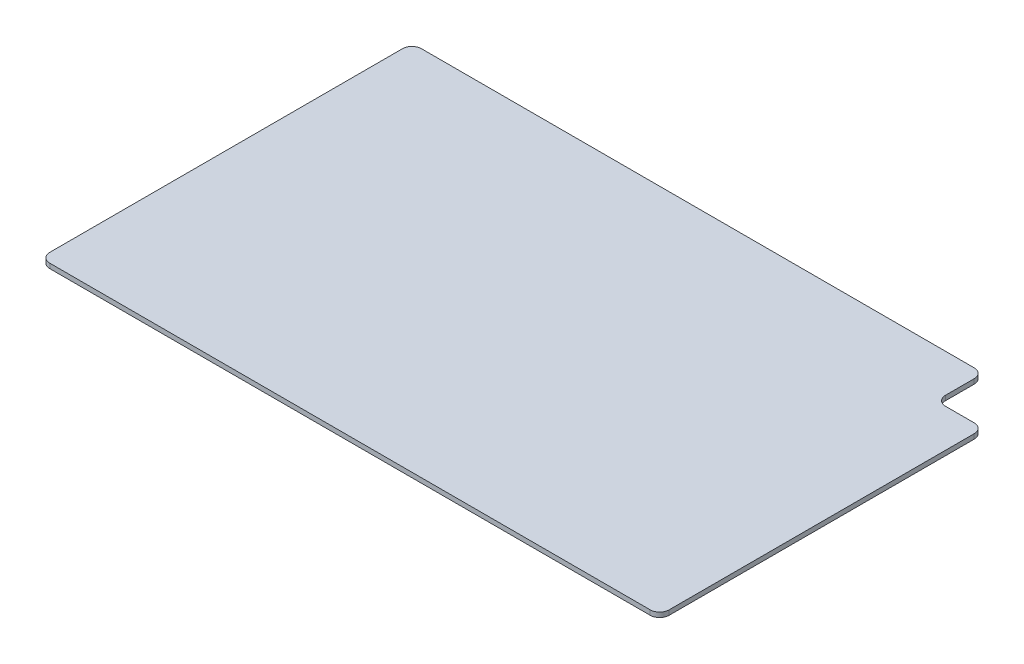
ISO-10303-21;
HEADER;
FILE_DESCRIPTION(('STEP AP214'),'2;1');
FILE_NAME('part.step','',(''),(''),'','','');
FILE_SCHEMA(('AUTOMOTIVE_DESIGN { 1 0 10303 214 1 1 1 1 }'));
ENDSEC;
DATA;
#1=APPLICATION_CONTEXT('core data for automotive mechanical design processes');
#2=APPLICATION_PROTOCOL_DEFINITION('international standard','automotive_design',2000,#1);
#3=PRODUCT_CONTEXT('',#1,'mechanical');
#4=PRODUCT('Part','Part','',(#3));
#5=PRODUCT_RELATED_PRODUCT_CATEGORY('part','',(#4));
#6=PRODUCT_DEFINITION_FORMATION('','',#4);
#7=PRODUCT_DEFINITION_CONTEXT('part definition',#1,'design');
#8=PRODUCT_DEFINITION('design','',#6,#7);
#9=PRODUCT_DEFINITION_SHAPE('','',#8);
#10=(LENGTH_UNIT() NAMED_UNIT(*) SI_UNIT(.MILLI.,.METRE.));
#11=(NAMED_UNIT(*) PLANE_ANGLE_UNIT() SI_UNIT($,.RADIAN.));
#12=(NAMED_UNIT(*) SI_UNIT($,.STERADIAN.) SOLID_ANGLE_UNIT());
#13=UNCERTAINTY_MEASURE_WITH_UNIT(LENGTH_MEASURE(1.E-05),#10,'distance_accuracy_value','');
#14=(GEOMETRIC_REPRESENTATION_CONTEXT(3) GLOBAL_UNCERTAINTY_ASSIGNED_CONTEXT((#13)) GLOBAL_UNIT_ASSIGNED_CONTEXT((#10,
#11,#12)) REPRESENTATION_CONTEXT('',''));
#15=CARTESIAN_POINT('',(0.,0.,0.));
#16=DIRECTION('',(0.,0.,1.));
#17=DIRECTION('',(1.,0.,0.));
#18=AXIS2_PLACEMENT_3D('',#15,#16,#17);
#19=CARTESIAN_POINT('',(6.62913907284768,0.5,20.4039735099338));
#20=DIRECTION('',(0.,0.,-1.));
#21=DIRECTION('',(-1.,0.,0.));
#22=AXIS2_PLACEMENT_3D('',#19,#20,#21);
#23=PLANE('',#22);
#24=DIRECTION('',(1.,0.,0.));
#25=VECTOR('',#24,1.);
#26=CARTESIAN_POINT('',(6.62913907284768,0.5,20.4039735099338));
#27=LINE('',#26,#25);
#28=CARTESIAN_POINT('',(-57.3708609271523,0.5,20.4039735099338));
#29=VERTEX_POINT('',#28);
#30=CARTESIAN_POINT('',(5.62913907284768,0.5,20.4039735099338));
#31=VERTEX_POINT('',#30);
#32=EDGE_CURVE('E170',#29,#31,#27,.T.);
#33=ORIENTED_EDGE('',*,*,#32,.F.);
#34=DIRECTION('',(0.,-1.,0.));
#35=VECTOR('',#34,1.);
#36=CARTESIAN_POINT('',(-57.3708609271523,0.5,20.4039735099338));
#37=LINE('',#36,#35);
#38=CARTESIAN_POINT('',(-57.3708609271523,0.,20.4039735099338));
#39=VERTEX_POINT('',#38);
#40=EDGE_CURVE('E210',#29,#39,#37,.T.);
#41=ORIENTED_EDGE('',*,*,#40,.T.);
#42=DIRECTION('',(1.,0.,0.));
#43=VECTOR('',#42,1.);
#44=CARTESIAN_POINT('',(6.62913907284768,0.,20.4039735099338));
#45=LINE('',#44,#43);
#46=CARTESIAN_POINT('',(5.62913907284768,0.,20.4039735099338));
#47=VERTEX_POINT('',#46);
#48=EDGE_CURVE('E156',#39,#47,#45,.T.);
#49=ORIENTED_EDGE('',*,*,#48,.T.);
#50=DIRECTION('',(0.,-1.,0.));
#51=VECTOR('',#50,1.);
#52=CARTESIAN_POINT('',(5.62913907284768,0.5,20.4039735099338));
#53=LINE('',#52,#51);
#54=EDGE_CURVE('E139',#47,#31,#53,.F.);
#55=ORIENTED_EDGE('',*,*,#54,.T.);
#56=EDGE_LOOP('',(#33,#41,#49,#55));
#57=FACE_BOUND('',#56,.T.);
#58=ADVANCED_FACE('F43',(#57),#23,.F.);
#59=CARTESIAN_POINT('',(6.62913907284767,0.5,-13.5960264900662));
#60=DIRECTION('',(-1.,0.,0.));
#61=DIRECTION('',(0.,0.,1.));
#62=AXIS2_PLACEMENT_3D('',#59,#60,#61);
#63=PLANE('',#62);
#64=DIRECTION('',(0.,0.,-1.));
#65=VECTOR('',#64,1.);
#66=CARTESIAN_POINT('',(6.62913907284767,0.,-13.5960264900662));
#67=LINE('',#66,#65);
#68=CARTESIAN_POINT('',(6.62913907284768,0.,19.4039735099338));
#69=VERTEX_POINT('',#68);
#70=CARTESIAN_POINT('',(6.62913907284767,0.,-12.5960264900662));
#71=VERTEX_POINT('',#70);
#72=EDGE_CURVE('E146',#69,#71,#67,.T.);
#73=ORIENTED_EDGE('',*,*,#72,.T.);
#74=DIRECTION('',(0.,-1.,0.));
#75=VECTOR('',#74,1.);
#76=CARTESIAN_POINT('',(6.62913907284767,0.5,-12.5960264900662));
#77=LINE('',#76,#75);
#78=CARTESIAN_POINT('',(6.62913907284767,0.5,-12.5960264900662));
#79=VERTEX_POINT('',#78);
#80=EDGE_CURVE('E195',#71,#79,#77,.F.);
#81=ORIENTED_EDGE('',*,*,#80,.T.);
#82=DIRECTION('',(0.,0.,-1.));
#83=VECTOR('',#82,1.);
#84=CARTESIAN_POINT('',(6.62913907284767,0.5,-13.5960264900662));
#85=LINE('',#84,#83);
#86=CARTESIAN_POINT('',(6.62913907284768,0.5,19.4039735099338));
#87=VERTEX_POINT('',#86);
#88=EDGE_CURVE('E149',#87,#79,#85,.T.);
#89=ORIENTED_EDGE('',*,*,#88,.F.);
#90=DIRECTION('',(0.,-1.,0.));
#91=VECTOR('',#90,1.);
#92=CARTESIAN_POINT('',(6.62913907284768,0.5,19.4039735099338));
#93=LINE('',#92,#91);
#94=EDGE_CURVE('E137',#87,#69,#93,.T.);
#95=ORIENTED_EDGE('',*,*,#94,.T.);
#96=EDGE_LOOP('',(#73,#81,#89,#95));
#97=FACE_BOUND('',#96,.T.);
#98=ADVANCED_FACE('F145',(#97),#63,.F.);
#99=CARTESIAN_POINT('',(1.62913907284767,0.5,-13.5960264900662));
#100=DIRECTION('',(0.,0.,1.));
#101=DIRECTION('',(1.,0.,0.));
#102=AXIS2_PLACEMENT_3D('',#99,#100,#101);
#103=PLANE('',#102);
#104=DIRECTION('',(-1.,0.,0.));
#105=VECTOR('',#104,1.);
#106=CARTESIAN_POINT('',(1.62913907284767,0.,-13.5960264900662));
#107=LINE('',#106,#105);
#108=CARTESIAN_POINT('',(5.62913907284767,0.,-13.5960264900662));
#109=VERTEX_POINT('',#108);
#110=CARTESIAN_POINT('',(2.62913907284767,0.,-13.5960264900662));
#111=VERTEX_POINT('',#110);
#112=EDGE_CURVE('E155',#109,#111,#107,.T.);
#113=ORIENTED_EDGE('',*,*,#112,.T.);
#114=DIRECTION('',(0.,-1.,0.));
#115=VECTOR('',#114,1.);
#116=CARTESIAN_POINT('',(2.62913907284767,0.5,-13.5960264900662));
#117=LINE('',#116,#115);
#118=CARTESIAN_POINT('',(2.62913907284767,0.5,-13.5960264900662));
#119=VERTEX_POINT('',#118);
#120=EDGE_CURVE('E193',#111,#119,#117,.F.);
#121=ORIENTED_EDGE('',*,*,#120,.T.);
#122=DIRECTION('',(-1.,0.,0.));
#123=VECTOR('',#122,1.);
#124=CARTESIAN_POINT('',(1.62913907284767,0.5,-13.5960264900662));
#125=LINE('',#124,#123);
#126=CARTESIAN_POINT('',(5.62913907284767,0.5,-13.5960264900662));
#127=VERTEX_POINT('',#126);
#128=EDGE_CURVE('E229',#127,#119,#125,.T.);
#129=ORIENTED_EDGE('',*,*,#128,.F.);
#130=DIRECTION('',(0.,-1.,0.));
#131=VECTOR('',#130,1.);
#132=CARTESIAN_POINT('',(5.62913907284767,0.5,-13.5960264900662));
#133=LINE('',#132,#131);
#134=EDGE_CURVE('E190',#127,#109,#133,.T.);
#135=ORIENTED_EDGE('',*,*,#134,.T.);
#136=EDGE_LOOP('',(#113,#121,#129,#135));
#137=FACE_BOUND('',#136,.T.);
#138=ADVANCED_FACE('F239',(#137),#103,.F.);
#139=CARTESIAN_POINT('',(1.62913907284767,0.5,-18.5960264900662));
#140=DIRECTION('',(-1.,0.,0.));
#141=DIRECTION('',(0.,0.,1.));
#142=AXIS2_PLACEMENT_3D('',#139,#140,#141);
#143=PLANE('',#142);
#144=DIRECTION('',(0.,0.,-1.));
#145=VECTOR('',#144,1.);
#146=CARTESIAN_POINT('',(1.62913907284767,0.,-18.5960264900662));
#147=LINE('',#146,#145);
#148=CARTESIAN_POINT('',(1.62913907284767,0.,-14.5960264900662));
#149=VERTEX_POINT('',#148);
#150=CARTESIAN_POINT('',(1.62913907284767,0.,-17.5960264900662));
#151=VERTEX_POINT('',#150);
#152=EDGE_CURVE('E159',#149,#151,#147,.T.);
#153=ORIENTED_EDGE('',*,*,#152,.T.);
#154=DIRECTION('',(0.,-1.,0.));
#155=VECTOR('',#154,1.);
#156=CARTESIAN_POINT('',(1.62913907284767,0.5,-17.5960264900662));
#157=LINE('',#156,#155);
#158=CARTESIAN_POINT('',(1.62913907284767,0.5,-17.5960264900662));
#159=VERTEX_POINT('',#158);
#160=EDGE_CURVE('E184',#151,#159,#157,.F.);
#161=ORIENTED_EDGE('',*,*,#160,.T.);
#162=DIRECTION('',(0.,0.,-1.));
#163=VECTOR('',#162,1.);
#164=CARTESIAN_POINT('',(1.62913907284767,0.5,-18.5960264900662));
#165=LINE('',#164,#163);
#166=CARTESIAN_POINT('',(1.62913907284767,0.5,-14.5960264900662));
#167=VERTEX_POINT('',#166);
#168=EDGE_CURVE('E224',#167,#159,#165,.T.);
#169=ORIENTED_EDGE('',*,*,#168,.F.);
#170=DIRECTION('',(0.,-1.,0.));
#171=VECTOR('',#170,1.);
#172=CARTESIAN_POINT('',(1.62913907284767,0.,-14.5960264900662));
#173=LINE('',#172,#171);
#174=EDGE_CURVE('E181',#167,#149,#173,.T.);
#175=ORIENTED_EDGE('',*,*,#174,.T.);
#176=EDGE_LOOP('',(#153,#161,#169,#175));
#177=FACE_BOUND('',#176,.T.);
#178=ADVANCED_FACE('F248',(#177),#143,.F.);
#179=CARTESIAN_POINT('',(-58.3708609271523,0.5,-18.5960264900662));
#180=DIRECTION('',(0.,0.,1.));
#181=DIRECTION('',(1.,0.,0.));
#182=AXIS2_PLACEMENT_3D('',#179,#180,#181);
#183=PLANE('',#182);
#184=DIRECTION('',(-1.,0.,0.));
#185=VECTOR('',#184,1.);
#186=CARTESIAN_POINT('',(-58.3708609271523,0.,-18.5960264900662));
#187=LINE('',#186,#185);
#188=CARTESIAN_POINT('',(0.629139072847673,0.,-18.5960264900662));
#189=VERTEX_POINT('',#188);
#190=CARTESIAN_POINT('',(-57.3708609271523,0.,-18.5960264900662));
#191=VERTEX_POINT('',#190);
#192=EDGE_CURVE('E166',#189,#191,#187,.T.);
#193=ORIENTED_EDGE('',*,*,#192,.T.);
#194=DIRECTION('',(0.,-1.,0.));
#195=VECTOR('',#194,1.);
#196=CARTESIAN_POINT('',(-57.3708609271523,0.5,-18.5960264900662));
#197=LINE('',#196,#195);
#198=CARTESIAN_POINT('',(-57.3708609271523,0.5,-18.5960264900662));
#199=VERTEX_POINT('',#198);
#200=EDGE_CURVE('E206',#191,#199,#197,.F.);
#201=ORIENTED_EDGE('',*,*,#200,.T.);
#202=DIRECTION('',(-1.,0.,0.));
#203=VECTOR('',#202,1.);
#204=CARTESIAN_POINT('',(-58.3708609271523,0.5,-18.5960264900662));
#205=LINE('',#204,#203);
#206=CARTESIAN_POINT('',(0.629139072847673,0.5,-18.5960264900662));
#207=VERTEX_POINT('',#206);
#208=EDGE_CURVE('E223',#207,#199,#205,.T.);
#209=ORIENTED_EDGE('',*,*,#208,.F.);
#210=DIRECTION('',(0.,-1.,0.));
#211=VECTOR('',#210,1.);
#212=CARTESIAN_POINT('',(0.629139072847673,0.5,-18.5960264900662));
#213=LINE('',#212,#211);
#214=EDGE_CURVE('E175',#207,#189,#213,.T.);
#215=ORIENTED_EDGE('',*,*,#214,.T.);
#216=EDGE_LOOP('',(#193,#201,#209,#215));
#217=FACE_BOUND('',#216,.T.);
#218=ADVANCED_FACE('F257',(#217),#183,.F.);
#219=CARTESIAN_POINT('',(-58.3708609271523,0.5,20.4039735099338));
#220=DIRECTION('',(1.,0.,0.));
#221=DIRECTION('',(0.,0.,-1.));
#222=AXIS2_PLACEMENT_3D('',#219,#220,#221);
#223=PLANE('',#222);
#224=DIRECTION('',(0.,0.,1.));
#225=VECTOR('',#224,1.);
#226=CARTESIAN_POINT('',(-58.3708609271523,0.,20.4039735099338));
#227=LINE('',#226,#225);
#228=CARTESIAN_POINT('',(-58.3708609271523,0.,-17.5960264900662));
#229=VERTEX_POINT('',#228);
#230=CARTESIAN_POINT('',(-58.3708609271523,0.,19.4039735099338));
#231=VERTEX_POINT('',#230);
#232=EDGE_CURVE('E169',#229,#231,#227,.T.);
#233=ORIENTED_EDGE('',*,*,#232,.T.);
#234=DIRECTION('',(0.,-1.,0.));
#235=VECTOR('',#234,1.);
#236=CARTESIAN_POINT('',(-58.3708609271523,0.5,19.4039735099338));
#237=LINE('',#236,#235);
#238=CARTESIAN_POINT('',(-58.3708609271523,0.5,19.4039735099338));
#239=VERTEX_POINT('',#238);
#240=EDGE_CURVE('E51',#231,#239,#237,.F.);
#241=ORIENTED_EDGE('',*,*,#240,.T.);
#242=DIRECTION('',(0.,0.,1.));
#243=VECTOR('',#242,1.);
#244=CARTESIAN_POINT('',(-58.3708609271523,0.5,20.4039735099338));
#245=LINE('',#244,#243);
#246=CARTESIAN_POINT('',(-58.3708609271523,0.5,-17.5960264900662));
#247=VERTEX_POINT('',#246);
#248=EDGE_CURVE('E150',#247,#239,#245,.T.);
#249=ORIENTED_EDGE('',*,*,#248,.F.);
#250=DIRECTION('',(0.,-1.,0.));
#251=VECTOR('',#250,1.);
#252=CARTESIAN_POINT('',(-58.3708609271523,0.5,-17.5960264900662));
#253=LINE('',#252,#251);
#254=EDGE_CURVE('E201',#247,#229,#253,.T.);
#255=ORIENTED_EDGE('',*,*,#254,.T.);
#256=EDGE_LOOP('',(#233,#241,#249,#255));
#257=FACE_BOUND('',#256,.T.);
#258=ADVANCED_FACE('F261',(#257),#223,.F.);
#259=CARTESIAN_POINT('',(0.,0.5,0.));
#260=DIRECTION('',(0.,-1.,0.));
#261=DIRECTION('',(0.,0.,-1.));
#262=AXIS2_PLACEMENT_3D('',#259,#260,#261);
#263=PLANE('',#262);
#264=ORIENTED_EDGE('',*,*,#248,.T.);
#265=CARTESIAN_POINT('',(-57.3708609271523,0.5,19.4039735099338));
#266=DIRECTION('',(0.,-1.,0.));
#267=DIRECTION('',(0.,0.,-1.));
#268=AXIS2_PLACEMENT_3D('',#265,#266,#267);
#269=CIRCLE('',#268,1.);
#270=EDGE_CURVE('E11',#239,#29,#269,.F.);
#271=ORIENTED_EDGE('',*,*,#270,.T.);
#272=ORIENTED_EDGE('',*,*,#32,.T.);
#273=CARTESIAN_POINT('',(5.62913907284768,0.5,19.4039735099338));
#274=DIRECTION('',(0.,-1.,0.));
#275=DIRECTION('',(0.,0.,-1.));
#276=AXIS2_PLACEMENT_3D('',#273,#274,#275);
#277=CIRCLE('',#276,1.);
#278=EDGE_CURVE('E173',#31,#87,#277,.F.);
#279=ORIENTED_EDGE('',*,*,#278,.T.);
#280=ORIENTED_EDGE('',*,*,#88,.T.);
#281=CARTESIAN_POINT('',(5.62913907284767,0.5,-12.5960264900662));
#282=DIRECTION('',(0.,-1.,0.));
#283=DIRECTION('',(0.,0.,-1.));
#284=AXIS2_PLACEMENT_3D('',#281,#282,#283);
#285=CIRCLE('',#284,1.);
#286=EDGE_CURVE('E186',#79,#127,#285,.F.);
#287=ORIENTED_EDGE('',*,*,#286,.T.);
#288=ORIENTED_EDGE('',*,*,#128,.T.);
#289=CARTESIAN_POINT('',(2.62913907284767,0.5,-14.5960264900662));
#290=DIRECTION('',(0.,-1.,0.));
#291=DIRECTION('',(0.,0.,-1.));
#292=AXIS2_PLACEMENT_3D('',#289,#290,#291);
#293=CIRCLE('',#292,1.);
#294=EDGE_CURVE('E199',#119,#167,#293,.T.);
#295=ORIENTED_EDGE('',*,*,#294,.T.);
#296=ORIENTED_EDGE('',*,*,#168,.T.);
#297=CARTESIAN_POINT('',(0.629139072847673,0.5,-17.5960264900662));
#298=DIRECTION('',(0.,-1.,0.));
#299=DIRECTION('',(0.,0.,-1.));
#300=AXIS2_PLACEMENT_3D('',#297,#298,#299);
#301=CIRCLE('',#300,1.);
#302=EDGE_CURVE('E188',#159,#207,#301,.F.);
#303=ORIENTED_EDGE('',*,*,#302,.T.);
#304=ORIENTED_EDGE('',*,*,#208,.T.);
#305=CARTESIAN_POINT('',(-57.3708609271523,0.5,-17.5960264900662));
#306=DIRECTION('',(0.,-1.,0.));
#307=DIRECTION('',(0.,0.,-1.));
#308=AXIS2_PLACEMENT_3D('',#305,#306,#307);
#309=CIRCLE('',#308,1.);
#310=EDGE_CURVE('E208',#199,#247,#309,.F.);
#311=ORIENTED_EDGE('',*,*,#310,.T.);
#312=EDGE_LOOP('',(#264,#271,#272,#279,#280,#287,#288,#295,#296,#303,#304,#311));
#313=FACE_BOUND('',#312,.T.);
#314=ADVANCED_FACE('F219',(#313),#263,.F.);
#315=CARTESIAN_POINT('',(0.,0.,0.));
#316=DIRECTION('',(0.,-1.,0.));
#317=DIRECTION('',(0.,0.,-1.));
#318=AXIS2_PLACEMENT_3D('',#315,#316,#317);
#319=PLANE('',#318);
#320=ORIENTED_EDGE('',*,*,#48,.F.);
#321=CARTESIAN_POINT('',(-57.3708609271523,0.,19.4039735099338));
#322=DIRECTION('',(0.,-1.,0.));
#323=DIRECTION('',(0.,0.,-1.));
#324=AXIS2_PLACEMENT_3D('',#321,#322,#323);
#325=CIRCLE('',#324,1.);
#326=EDGE_CURVE('E65',#39,#231,#325,.T.);
#327=ORIENTED_EDGE('',*,*,#326,.T.);
#328=ORIENTED_EDGE('',*,*,#232,.F.);
#329=CARTESIAN_POINT('',(-57.3708609271523,0.,-17.5960264900662));
#330=DIRECTION('',(0.,-1.,0.));
#331=DIRECTION('',(0.,0.,-1.));
#332=AXIS2_PLACEMENT_3D('',#329,#330,#331);
#333=CIRCLE('',#332,1.);
#334=EDGE_CURVE('E204',#229,#191,#333,.T.);
#335=ORIENTED_EDGE('',*,*,#334,.T.);
#336=ORIENTED_EDGE('',*,*,#192,.F.);
#337=CARTESIAN_POINT('',(0.629139072847673,0.,-17.5960264900662));
#338=DIRECTION('',(0.,-1.,0.));
#339=DIRECTION('',(0.,0.,-1.));
#340=AXIS2_PLACEMENT_3D('',#337,#338,#339);
#341=CIRCLE('',#340,1.);
#342=EDGE_CURVE('E179',#189,#151,#341,.T.);
#343=ORIENTED_EDGE('',*,*,#342,.T.);
#344=ORIENTED_EDGE('',*,*,#152,.F.);
#345=CARTESIAN_POINT('',(2.62913907284767,0.,-14.5960264900662));
#346=DIRECTION('',(0.,-1.,0.));
#347=DIRECTION('',(0.,0.,-1.));
#348=AXIS2_PLACEMENT_3D('',#345,#346,#347);
#349=CIRCLE('',#348,1.);
#350=EDGE_CURVE('E197',#149,#111,#349,.F.);
#351=ORIENTED_EDGE('',*,*,#350,.T.);
#352=ORIENTED_EDGE('',*,*,#112,.F.);
#353=CARTESIAN_POINT('',(5.62913907284767,0.,-12.5960264900662));
#354=DIRECTION('',(0.,-1.,0.));
#355=DIRECTION('',(0.,0.,-1.));
#356=AXIS2_PLACEMENT_3D('',#353,#354,#355);
#357=CIRCLE('',#356,1.);
#358=EDGE_CURVE('E154',#109,#71,#357,.T.);
#359=ORIENTED_EDGE('',*,*,#358,.T.);
#360=ORIENTED_EDGE('',*,*,#72,.F.);
#361=CARTESIAN_POINT('',(5.62913907284768,0.,19.4039735099338));
#362=DIRECTION('',(0.,-1.,0.));
#363=DIRECTION('',(0.,0.,-1.));
#364=AXIS2_PLACEMENT_3D('',#361,#362,#363);
#365=CIRCLE('',#364,1.);
#366=EDGE_CURVE('E133',#69,#47,#365,.T.);
#367=ORIENTED_EDGE('',*,*,#366,.T.);
#368=EDGE_LOOP('',(#320,#327,#328,#335,#336,#343,#344,#351,#352,#359,#360,#367));
#369=FACE_BOUND('',#368,.T.);
#370=ADVANCED_FACE('F152',(#369),#319,.T.);
#371=CARTESIAN_POINT('',(5.62913907284768,0.5,19.4039735099338));
#372=DIRECTION('',(0.,-1.,0.));
#373=DIRECTION('',(0.,0.,-1.));
#374=AXIS2_PLACEMENT_3D('',#371,#372,#373);
#375=CYLINDRICAL_SURFACE('',#374,1.);
#376=ORIENTED_EDGE('',*,*,#278,.F.);
#377=ORIENTED_EDGE('',*,*,#54,.F.);
#378=ORIENTED_EDGE('',*,*,#366,.F.);
#379=ORIENTED_EDGE('',*,*,#94,.F.);
#380=EDGE_LOOP('',(#376,#377,#378,#379));
#381=FACE_BOUND('',#380,.T.);
#382=ADVANCED_FACE('F136',(#381),#375,.T.);
#383=CARTESIAN_POINT('',(0.629139072847673,0.5,-17.5960264900662));
#384=DIRECTION('',(0.,-1.,0.));
#385=DIRECTION('',(0.,0.,-1.));
#386=AXIS2_PLACEMENT_3D('',#383,#384,#385);
#387=CYLINDRICAL_SURFACE('',#386,1.);
#388=ORIENTED_EDGE('',*,*,#302,.F.);
#389=ORIENTED_EDGE('',*,*,#160,.F.);
#390=ORIENTED_EDGE('',*,*,#342,.F.);
#391=ORIENTED_EDGE('',*,*,#214,.F.);
#392=EDGE_LOOP('',(#388,#389,#390,#391));
#393=FACE_BOUND('',#392,.T.);
#394=ADVANCED_FACE('F254',(#393),#387,.T.);
#395=CARTESIAN_POINT('',(2.62913907284767,0.5,-14.5960264900662));
#396=DIRECTION('',(0.,1.,0.));
#397=DIRECTION('',(0.,0.,1.));
#398=AXIS2_PLACEMENT_3D('',#395,#396,#397);
#399=CYLINDRICAL_SURFACE('',#398,1.);
#400=ORIENTED_EDGE('',*,*,#294,.F.);
#401=ORIENTED_EDGE('',*,*,#120,.F.);
#402=ORIENTED_EDGE('',*,*,#350,.F.);
#403=ORIENTED_EDGE('',*,*,#174,.F.);
#404=EDGE_LOOP('',(#400,#401,#402,#403));
#405=FACE_BOUND('',#404,.T.);
#406=ADVANCED_FACE('F245',(#405),#399,.F.);
#407=CARTESIAN_POINT('',(5.62913907284767,0.5,-12.5960264900662));
#408=DIRECTION('',(0.,-1.,0.));
#409=DIRECTION('',(0.,0.,-1.));
#410=AXIS2_PLACEMENT_3D('',#407,#408,#409);
#411=CYLINDRICAL_SURFACE('',#410,1.);
#412=ORIENTED_EDGE('',*,*,#286,.F.);
#413=ORIENTED_EDGE('',*,*,#80,.F.);
#414=ORIENTED_EDGE('',*,*,#358,.F.);
#415=ORIENTED_EDGE('',*,*,#134,.F.);
#416=EDGE_LOOP('',(#412,#413,#414,#415));
#417=FACE_BOUND('',#416,.T.);
#418=ADVANCED_FACE('F237',(#417),#411,.T.);
#419=CARTESIAN_POINT('',(-57.3708609271523,0.5,-17.5960264900662));
#420=DIRECTION('',(0.,-1.,0.));
#421=DIRECTION('',(0.,0.,-1.));
#422=AXIS2_PLACEMENT_3D('',#419,#420,#421);
#423=CYLINDRICAL_SURFACE('',#422,1.);
#424=ORIENTED_EDGE('',*,*,#310,.F.);
#425=ORIENTED_EDGE('',*,*,#200,.F.);
#426=ORIENTED_EDGE('',*,*,#334,.F.);
#427=ORIENTED_EDGE('',*,*,#254,.F.);
#428=EDGE_LOOP('',(#424,#425,#426,#427));
#429=FACE_BOUND('',#428,.T.);
#430=ADVANCED_FACE('F260',(#429),#423,.T.);
#431=CARTESIAN_POINT('',(-57.3708609271523,0.5,19.4039735099338));
#432=DIRECTION('',(0.,-1.,0.));
#433=DIRECTION('',(0.,0.,-1.));
#434=AXIS2_PLACEMENT_3D('',#431,#432,#433);
#435=CYLINDRICAL_SURFACE('',#434,1.);
#436=ORIENTED_EDGE('',*,*,#270,.F.);
#437=ORIENTED_EDGE('',*,*,#240,.F.);
#438=ORIENTED_EDGE('',*,*,#326,.F.);
#439=ORIENTED_EDGE('',*,*,#40,.F.);
#440=EDGE_LOOP('',(#436,#437,#438,#439));
#441=FACE_BOUND('',#440,.T.);
#442=ADVANCED_FACE('F45',(#441),#435,.T.);
#443=CLOSED_SHELL('',(#58,#98,#138,#178,#218,#258,#314,#370,#382,#394,#406,#418,#430,#442));
#444=MANIFOLD_SOLID_BREP('B2',#443);
#445=ADVANCED_BREP_SHAPE_REPRESENTATION('',(#18,#444),#14);
#446=SHAPE_DEFINITION_REPRESENTATION(#9,#445);
ENDSEC;
END-ISO-10303-21;
